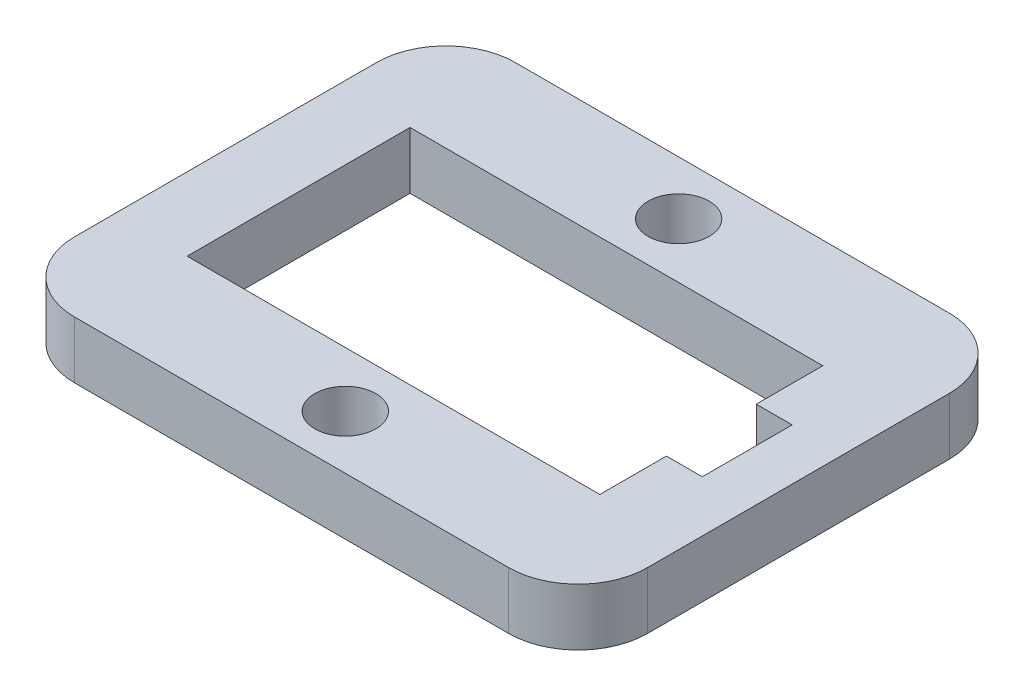
ISO-10303-21;
HEADER;
FILE_DESCRIPTION(('STEP AP214'),'2;1');
FILE_NAME('part.step','',(''),(''),'','','');
FILE_SCHEMA(('AUTOMOTIVE_DESIGN { 1 0 10303 214 1 1 1 1 }'));
ENDSEC;
DATA;
#1=APPLICATION_CONTEXT('core data for automotive mechanical design processes');
#2=APPLICATION_PROTOCOL_DEFINITION('international standard','automotive_design',2000,#1);
#3=PRODUCT_CONTEXT('',#1,'mechanical');
#4=PRODUCT('Part','Part','',(#3));
#5=PRODUCT_RELATED_PRODUCT_CATEGORY('part','',(#4));
#6=PRODUCT_DEFINITION_FORMATION('','',#4);
#7=PRODUCT_DEFINITION_CONTEXT('part definition',#1,'design');
#8=PRODUCT_DEFINITION('design','',#6,#7);
#9=PRODUCT_DEFINITION_SHAPE('','',#8);
#10=(LENGTH_UNIT() NAMED_UNIT(*) SI_UNIT(.MILLI.,.METRE.));
#11=(NAMED_UNIT(*) PLANE_ANGLE_UNIT() SI_UNIT($,.RADIAN.));
#12=(NAMED_UNIT(*) SI_UNIT($,.STERADIAN.) SOLID_ANGLE_UNIT());
#13=UNCERTAINTY_MEASURE_WITH_UNIT(LENGTH_MEASURE(1.E-05),#10,'distance_accuracy_value','');
#14=(GEOMETRIC_REPRESENTATION_CONTEXT(3) GLOBAL_UNCERTAINTY_ASSIGNED_CONTEXT((#13)) GLOBAL_UNIT_ASSIGNED_CONTEXT((#10,
#11,#12)) REPRESENTATION_CONTEXT('',''));
#15=CARTESIAN_POINT('',(0.,0.,0.));
#16=DIRECTION('',(0.,0.,1.));
#17=DIRECTION('',(1.,0.,0.));
#18=AXIS2_PLACEMENT_3D('',#15,#16,#17);
#19=CARTESIAN_POINT('',(-1.42519670598732,3.175,-11.9071943955369));
#20=DIRECTION('',(0.,1.,0.));
#21=DIRECTION('',(0.,0.,1.));
#22=AXIS2_PLACEMENT_3D('',#19,#20,#21);
#23=PLANE('',#22);
#24=CARTESIAN_POINT('',(-13.5078691293302,3.175,-12.7791614699957));
#25=DIRECTION('',(0.,1.,0.));
#26=DIRECTION('',(0.,0.,1.));
#27=AXIS2_PLACEMENT_3D('',#24,#25,#26);
#28=CIRCLE('',#27,1.700000029);
#29=CARTESIAN_POINT('',(-13.5078691293302,3.175,-11.0791614409957));
#30=VERTEX_POINT('',#29);
#31=EDGE_CURVE('E184',#30,#30,#28,.T.);
#32=ORIENTED_EDGE('',*,*,#31,.F.);
#33=EDGE_LOOP('',(#32));
#34=FACE_BOUND('',#33,.T.);
#35=CARTESIAN_POINT('',(-1.42519670598732,3.175,-11.9071943955369));
#36=DIRECTION('',(0.,1.,0.));
#37=DIRECTION('',(0.,0.,1.));
#38=AXIS2_PLACEMENT_3D('',#35,#36,#37);
#39=CIRCLE('',#38,3.85587562995337);
#40=CARTESIAN_POINT('',(2.43067892396605,3.175,-11.9071943955369));
#41=VERTEX_POINT('',#40);
#42=CARTESIAN_POINT('',(-1.42519670598732,3.175,-15.7630700254903));
#43=VERTEX_POINT('',#42);
#44=EDGE_CURVE('E214',#41,#43,#39,.T.);
#45=ORIENTED_EDGE('',*,*,#44,.T.);
#46=DIRECTION('',(-1.,0.,0.));
#47=VECTOR('',#46,1.);
#48=CARTESIAN_POINT('',(-1.42519670598732,3.175,-15.7630700254903));
#49=LINE('',#48,#47);
#50=CARTESIAN_POINT('',(-25.5836145207176,3.175,-15.7630700254903));
#51=VERTEX_POINT('',#50);
#52=EDGE_CURVE('E217',#43,#51,#49,.T.);
#53=ORIENTED_EDGE('',*,*,#52,.T.);
#54=CARTESIAN_POINT('',(-25.5836145207176,3.175,-11.9071943955369));
#55=DIRECTION('',(0.,1.,0.));
#56=DIRECTION('',(0.,0.,1.));
#57=AXIS2_PLACEMENT_3D('',#54,#55,#56);
#58=CIRCLE('',#57,3.85587562995337);
#59=CARTESIAN_POINT('',(-29.439490150671,3.175,-11.9071943955369));
#60=VERTEX_POINT('',#59);
#61=EDGE_CURVE('E220',#51,#60,#58,.T.);
#62=ORIENTED_EDGE('',*,*,#61,.T.);
#63=DIRECTION('',(0.,0.,1.));
#64=VECTOR('',#63,1.);
#65=CARTESIAN_POINT('',(-29.439490150671,3.175,-11.9071943955369));
#66=LINE('',#65,#64);
#67=CARTESIAN_POINT('',(-29.439490150671,3.175,4.88887145954559));
#68=VERTEX_POINT('',#67);
#69=EDGE_CURVE('E222',#60,#68,#66,.T.);
#70=ORIENTED_EDGE('',*,*,#69,.T.);
#71=CARTESIAN_POINT('',(-25.576628785035,3.175,4.88887145954559));
#72=DIRECTION('',(0.,1.,0.));
#73=DIRECTION('',(0.,0.,1.));
#74=AXIS2_PLACEMENT_3D('',#71,#72,#73);
#75=CIRCLE('',#74,3.86286136563595);
#76=CARTESIAN_POINT('',(-25.576628785035,3.175,8.75173282518153));
#77=VERTEX_POINT('',#76);
#78=EDGE_CURVE('E224',#68,#77,#75,.T.);
#79=ORIENTED_EDGE('',*,*,#78,.T.);
#80=DIRECTION('',(1.,0.,0.));
#81=VECTOR('',#80,1.);
#82=CARTESIAN_POINT('',(-25.576628785035,3.175,8.75173282518153));
#83=LINE('',#82,#81);
#84=CARTESIAN_POINT('',(-1.43218244166989,3.175,8.75173282518153));
#85=VERTEX_POINT('',#84);
#86=EDGE_CURVE('E226',#77,#85,#83,.T.);
#87=ORIENTED_EDGE('',*,*,#86,.T.);
#88=CARTESIAN_POINT('',(-1.43218244166989,3.175,4.88887145954558));
#89=DIRECTION('',(0.,1.,0.));
#90=DIRECTION('',(0.,0.,1.));
#91=AXIS2_PLACEMENT_3D('',#88,#89,#90);
#92=CIRCLE('',#91,3.86286136563595);
#93=CARTESIAN_POINT('',(2.43067892396605,3.175,4.88887145954558));
#94=VERTEX_POINT('',#93);
#95=EDGE_CURVE('E228',#85,#94,#92,.T.);
#96=ORIENTED_EDGE('',*,*,#95,.T.);
#97=DIRECTION('',(0.,0.,-1.));
#98=VECTOR('',#97,1.);
#99=CARTESIAN_POINT('',(2.43067892396605,3.175,4.88887145954558));
#100=LINE('',#99,#98);
#101=EDGE_CURVE('E230',#94,#41,#100,.T.);
#102=ORIENTED_EDGE('',*,*,#101,.T.);
#103=EDGE_LOOP('',(#45,#53,#62,#70,#79,#87,#96,#102));
#104=FACE_BOUND('',#103,.T.);
#105=DIRECTION('',(-1.,0.,0.));
#106=VECTOR('',#105,1.);
#107=CARTESIAN_POINT('',(-2.41675038914296,3.175,-9.70933956799569));
#108=LINE('',#107,#106);
#109=CARTESIAN_POINT('',(-2.41675038914296,3.175,-9.70933956799569));
#110=VERTEX_POINT('',#109);
#111=CARTESIAN_POINT('',(-25.3759162308973,3.175,-9.70933956799567));
#112=VERTEX_POINT('',#111);
#113=EDGE_CURVE('E154',#110,#112,#108,.T.);
#114=ORIENTED_EDGE('',*,*,#113,.F.);
#115=DIRECTION('',(0.,0.,-1.));
#116=VECTOR('',#115,1.);
#117=CARTESIAN_POINT('',(-2.41675038914296,3.175,-6.00923992684857));
#118=LINE('',#117,#116);
#119=CARTESIAN_POINT('',(-2.41675038914296,3.175,-6.00923992684857));
#120=VERTEX_POINT('',#119);
#121=EDGE_CURVE('E146',#120,#110,#118,.T.);
#122=ORIENTED_EDGE('',*,*,#121,.F.);
#123=DIRECTION('',(-1.,0.,0.));
#124=VECTOR('',#123,1.);
#125=CARTESIAN_POINT('',(-0.42010239804857,3.175,-6.00923992684857));
#126=LINE('',#125,#124);
#127=CARTESIAN_POINT('',(-0.42010239804857,3.175,-6.00923992684857));
#128=VERTEX_POINT('',#127);
#129=EDGE_CURVE('E181',#128,#120,#126,.T.);
#130=ORIENTED_EDGE('',*,*,#129,.F.);
#131=DIRECTION('',(0.,0.,-1.));
#132=VECTOR('',#131,1.);
#133=CARTESIAN_POINT('',(-0.420102398048568,3.175,-1.00908943940521));
#134=LINE('',#133,#132);
#135=CARTESIAN_POINT('',(-0.420102398048568,3.175,-1.00908943940521));
#136=VERTEX_POINT('',#135);
#137=EDGE_CURVE('E179',#136,#128,#134,.T.);
#138=ORIENTED_EDGE('',*,*,#137,.F.);
#139=DIRECTION('',(1.,0.,0.));
#140=VECTOR('',#139,1.);
#141=CARTESIAN_POINT('',(-2.41675038914296,3.175,-1.00908943940521));
#142=LINE('',#141,#140);
#143=CARTESIAN_POINT('',(-2.41675038914296,3.175,-1.00908943940521));
#144=VERTEX_POINT('',#143);
#145=EDGE_CURVE('E177',#144,#136,#142,.T.);
#146=ORIENTED_EDGE('',*,*,#145,.F.);
#147=DIRECTION('',(0.,0.,-1.));
#148=VECTOR('',#147,1.);
#149=CARTESIAN_POINT('',(-2.41675038914296,3.175,2.6910102017419));
#150=LINE('',#149,#148);
#151=CARTESIAN_POINT('',(-2.41675038914296,3.175,2.6910102017419));
#152=VERTEX_POINT('',#151);
#153=EDGE_CURVE('E175',#152,#144,#150,.T.);
#154=ORIENTED_EDGE('',*,*,#153,.F.);
#155=DIRECTION('',(1.,0.,0.));
#156=VECTOR('',#155,1.);
#157=CARTESIAN_POINT('',(-25.3759162308973,3.175,2.69101020174191));
#158=LINE('',#157,#156);
#159=CARTESIAN_POINT('',(-25.3759162308973,3.175,2.69101020174191));
#160=VERTEX_POINT('',#159);
#161=EDGE_CURVE('E170',#160,#152,#158,.T.);
#162=ORIENTED_EDGE('',*,*,#161,.F.);
#163=DIRECTION('',(0.,0.,1.));
#164=VECTOR('',#163,1.);
#165=CARTESIAN_POINT('',(-25.3759162308973,3.175,-9.70933956799567));
#166=LINE('',#165,#164);
#167=EDGE_CURVE('E168',#112,#160,#166,.T.);
#168=ORIENTED_EDGE('',*,*,#167,.F.);
#169=EDGE_LOOP('',(#114,#122,#130,#138,#146,#154,#162,#168));
#170=FACE_BOUND('',#169,.T.);
#171=CARTESIAN_POINT('',(-13.5078691293302,3.175,5.76083853400432));
#172=DIRECTION('',(0.,1.,0.));
#173=DIRECTION('',(0.,0.,1.));
#174=AXIS2_PLACEMENT_3D('',#171,#172,#173);
#175=CIRCLE('',#174,1.700000029);
#176=CARTESIAN_POINT('',(-13.5078691293302,3.175,7.46083856300432));
#177=VERTEX_POINT('',#176);
#178=EDGE_CURVE('E370',#177,#177,#175,.T.);
#179=ORIENTED_EDGE('',*,*,#178,.F.);
#180=EDGE_LOOP('',(#179));
#181=FACE_BOUND('',#180,.T.);
#182=ADVANCED_FACE('F33',(#34,#104,#170,#181),#23,.T.);
#183=CARTESIAN_POINT('',(-1.42519670598732,0.,-11.9071943955369));
#184=DIRECTION('',(0.,1.,0.));
#185=DIRECTION('',(0.,0.,1.));
#186=AXIS2_PLACEMENT_3D('',#183,#184,#185);
#187=PLANE('',#186);
#188=CARTESIAN_POINT('',(-1.42519670598732,0.,-11.9071943955369));
#189=DIRECTION('',(0.,1.,0.));
#190=DIRECTION('',(0.,0.,1.));
#191=AXIS2_PLACEMENT_3D('',#188,#189,#190);
#192=CIRCLE('',#191,3.85587562995337);
#193=CARTESIAN_POINT('',(2.43067892396605,0.,-11.9071943955369));
#194=VERTEX_POINT('',#193);
#195=CARTESIAN_POINT('',(-1.42519670598732,0.,-15.7630700254903));
#196=VERTEX_POINT('',#195);
#197=EDGE_CURVE('E162',#194,#196,#192,.T.);
#198=ORIENTED_EDGE('',*,*,#197,.F.);
#199=DIRECTION('',(0.,0.,-1.));
#200=VECTOR('',#199,1.);
#201=CARTESIAN_POINT('',(2.43067892396605,0.,4.88887145954558));
#202=LINE('',#201,#200);
#203=CARTESIAN_POINT('',(2.43067892396605,0.,4.88887145954558));
#204=VERTEX_POINT('',#203);
#205=EDGE_CURVE('E218',#204,#194,#202,.T.);
#206=ORIENTED_EDGE('',*,*,#205,.F.);
#207=CARTESIAN_POINT('',(-1.43218244166989,0.,4.88887145954558));
#208=DIRECTION('',(0.,1.,0.));
#209=DIRECTION('',(0.,0.,1.));
#210=AXIS2_PLACEMENT_3D('',#207,#208,#209);
#211=CIRCLE('',#210,3.86286136563595);
#212=CARTESIAN_POINT('',(-1.43218244166989,0.,8.75173282518153));
#213=VERTEX_POINT('',#212);
#214=EDGE_CURVE('E245',#213,#204,#211,.T.);
#215=ORIENTED_EDGE('',*,*,#214,.F.);
#216=DIRECTION('',(1.,0.,0.));
#217=VECTOR('',#216,1.);
#218=CARTESIAN_POINT('',(-25.576628785035,0.,8.75173282518153));
#219=LINE('',#218,#217);
#220=CARTESIAN_POINT('',(-25.576628785035,0.,8.75173282518153));
#221=VERTEX_POINT('',#220);
#222=EDGE_CURVE('E243',#221,#213,#219,.T.);
#223=ORIENTED_EDGE('',*,*,#222,.F.);
#224=CARTESIAN_POINT('',(-25.576628785035,0.,4.88887145954559));
#225=DIRECTION('',(0.,1.,0.));
#226=DIRECTION('',(0.,0.,1.));
#227=AXIS2_PLACEMENT_3D('',#224,#225,#226);
#228=CIRCLE('',#227,3.86286136563595);
#229=CARTESIAN_POINT('',(-29.439490150671,0.,4.88887145954559));
#230=VERTEX_POINT('',#229);
#231=EDGE_CURVE('E241',#230,#221,#228,.T.);
#232=ORIENTED_EDGE('',*,*,#231,.F.);
#233=DIRECTION('',(0.,0.,1.));
#234=VECTOR('',#233,1.);
#235=CARTESIAN_POINT('',(-29.439490150671,0.,-11.9071943955369));
#236=LINE('',#235,#234);
#237=CARTESIAN_POINT('',(-29.439490150671,0.,-11.9071943955369));
#238=VERTEX_POINT('',#237);
#239=EDGE_CURVE('E239',#238,#230,#236,.T.);
#240=ORIENTED_EDGE('',*,*,#239,.F.);
#241=CARTESIAN_POINT('',(-25.5836145207176,0.,-11.9071943955369));
#242=DIRECTION('',(0.,1.,0.));
#243=DIRECTION('',(0.,0.,1.));
#244=AXIS2_PLACEMENT_3D('',#241,#242,#243);
#245=CIRCLE('',#244,3.85587562995337);
#246=CARTESIAN_POINT('',(-25.5836145207176,0.,-15.7630700254903));
#247=VERTEX_POINT('',#246);
#248=EDGE_CURVE('E237',#247,#238,#245,.T.);
#249=ORIENTED_EDGE('',*,*,#248,.F.);
#250=DIRECTION('',(-1.,0.,0.));
#251=VECTOR('',#250,1.);
#252=CARTESIAN_POINT('',(-1.42519670598732,0.,-15.7630700254903));
#253=LINE('',#252,#251);
#254=EDGE_CURVE('E235',#196,#247,#253,.T.);
#255=ORIENTED_EDGE('',*,*,#254,.F.);
#256=EDGE_LOOP('',(#198,#206,#215,#223,#232,#240,#249,#255));
#257=FACE_BOUND('',#256,.T.);
#258=DIRECTION('',(0.,0.,-1.));
#259=VECTOR('',#258,1.);
#260=CARTESIAN_POINT('',(-2.41675038914296,0.,-6.00923992684857));
#261=LINE('',#260,#259);
#262=CARTESIAN_POINT('',(-2.41675038914296,0.,-6.00923992684857));
#263=VERTEX_POINT('',#262);
#264=CARTESIAN_POINT('',(-2.41675038914296,0.,-9.70933956799569));
#265=VERTEX_POINT('',#264);
#266=EDGE_CURVE('E56',#263,#265,#261,.T.);
#267=ORIENTED_EDGE('',*,*,#266,.T.);
#268=DIRECTION('',(-1.,0.,0.));
#269=VECTOR('',#268,1.);
#270=CARTESIAN_POINT('',(-2.41675038914296,0.,-9.70933956799569));
#271=LINE('',#270,#269);
#272=CARTESIAN_POINT('',(-25.3759162308973,0.,-9.70933956799567));
#273=VERTEX_POINT('',#272);
#274=EDGE_CURVE('E161',#265,#273,#271,.T.);
#275=ORIENTED_EDGE('',*,*,#274,.T.);
#276=DIRECTION('',(0.,0.,1.));
#277=VECTOR('',#276,1.);
#278=CARTESIAN_POINT('',(-25.3759162308973,0.,-9.70933956799567));
#279=LINE('',#278,#277);
#280=CARTESIAN_POINT('',(-25.3759162308973,0.,2.69101020174191));
#281=VERTEX_POINT('',#280);
#282=EDGE_CURVE('E186',#273,#281,#279,.T.);
#283=ORIENTED_EDGE('',*,*,#282,.T.);
#284=DIRECTION('',(1.,0.,0.));
#285=VECTOR('',#284,1.);
#286=CARTESIAN_POINT('',(-25.3759162308973,0.,2.69101020174191));
#287=LINE('',#286,#285);
#288=CARTESIAN_POINT('',(-2.41675038914296,0.,2.6910102017419));
#289=VERTEX_POINT('',#288);
#290=EDGE_CURVE('E189',#281,#289,#287,.T.);
#291=ORIENTED_EDGE('',*,*,#290,.T.);
#292=DIRECTION('',(0.,0.,-1.));
#293=VECTOR('',#292,1.);
#294=CARTESIAN_POINT('',(-2.41675038914296,0.,2.6910102017419));
#295=LINE('',#294,#293);
#296=CARTESIAN_POINT('',(-2.41675038914296,0.,-1.00908943940521));
#297=VERTEX_POINT('',#296);
#298=EDGE_CURVE('E192',#289,#297,#295,.T.);
#299=ORIENTED_EDGE('',*,*,#298,.T.);
#300=DIRECTION('',(1.,0.,0.));
#301=VECTOR('',#300,1.);
#302=CARTESIAN_POINT('',(-2.41675038914296,0.,-1.00908943940521));
#303=LINE('',#302,#301);
#304=CARTESIAN_POINT('',(-0.420102398048568,0.,-1.00908943940521));
#305=VERTEX_POINT('',#304);
#306=EDGE_CURVE('E195',#297,#305,#303,.T.);
#307=ORIENTED_EDGE('',*,*,#306,.T.);
#308=DIRECTION('',(0.,0.,-1.));
#309=VECTOR('',#308,1.);
#310=CARTESIAN_POINT('',(-0.420102398048568,0.,-1.00908943940521));
#311=LINE('',#310,#309);
#312=CARTESIAN_POINT('',(-0.42010239804857,0.,-6.00923992684857));
#313=VERTEX_POINT('',#312);
#314=EDGE_CURVE('E198',#305,#313,#311,.T.);
#315=ORIENTED_EDGE('',*,*,#314,.T.);
#316=DIRECTION('',(-1.,0.,0.));
#317=VECTOR('',#316,1.);
#318=CARTESIAN_POINT('',(-0.42010239804857,0.,-6.00923992684857));
#319=LINE('',#318,#317);
#320=EDGE_CURVE('E155',#313,#263,#319,.T.);
#321=ORIENTED_EDGE('',*,*,#320,.T.);
#322=EDGE_LOOP('',(#267,#275,#283,#291,#299,#307,#315,#321));
#323=FACE_BOUND('',#322,.T.);
#324=CARTESIAN_POINT('',(-13.5078691293302,0.,-12.7791614699957));
#325=DIRECTION('',(0.,1.,0.));
#326=DIRECTION('',(0.,0.,1.));
#327=AXIS2_PLACEMENT_3D('',#324,#325,#326);
#328=CIRCLE('',#327,1.700000029);
#329=CARTESIAN_POINT('',(-13.5078691293302,0.,-11.0791614409957));
#330=VERTEX_POINT('',#329);
#331=EDGE_CURVE('E376',#330,#330,#328,.T.);
#332=ORIENTED_EDGE('',*,*,#331,.T.);
#333=EDGE_LOOP('',(#332));
#334=FACE_BOUND('',#333,.T.);
#335=CARTESIAN_POINT('',(-13.5078691293302,0.,5.76083853400432));
#336=DIRECTION('',(0.,1.,0.));
#337=DIRECTION('',(0.,0.,1.));
#338=AXIS2_PLACEMENT_3D('',#335,#336,#337);
#339=CIRCLE('',#338,1.700000029);
#340=CARTESIAN_POINT('',(-13.5078691293302,0.,7.46083856300432));
#341=VERTEX_POINT('',#340);
#342=EDGE_CURVE('E373',#341,#341,#339,.T.);
#343=ORIENTED_EDGE('',*,*,#342,.T.);
#344=EDGE_LOOP('',(#343));
#345=FACE_BOUND('',#344,.T.);
#346=ADVANCED_FACE('F275',(#257,#323,#334,#345),#187,.F.);
#347=CARTESIAN_POINT('',(-1.42519670598732,3.175,-11.9071943955369));
#348=DIRECTION('',(0.,-1.,0.));
#349=DIRECTION('',(0.,0.,-1.));
#350=AXIS2_PLACEMENT_3D('',#347,#348,#349);
#351=CYLINDRICAL_SURFACE('',#350,3.85587562995337);
#352=ORIENTED_EDGE('',*,*,#197,.T.);
#353=DIRECTION('',(0.,-1.,0.));
#354=VECTOR('',#353,1.);
#355=CARTESIAN_POINT('',(-1.42519670598732,3.175,-15.7630700254903));
#356=LINE('',#355,#354);
#357=EDGE_CURVE('E11',#43,#196,#356,.T.);
#358=ORIENTED_EDGE('',*,*,#357,.F.);
#359=ORIENTED_EDGE('',*,*,#44,.F.);
#360=DIRECTION('',(0.,-1.,0.));
#361=VECTOR('',#360,1.);
#362=CARTESIAN_POINT('',(2.43067892396605,3.175,-11.9071943955369));
#363=LINE('',#362,#361);
#364=EDGE_CURVE('E232',#41,#194,#363,.T.);
#365=ORIENTED_EDGE('',*,*,#364,.T.);
#366=EDGE_LOOP('',(#352,#358,#359,#365));
#367=FACE_BOUND('',#366,.T.);
#368=ADVANCED_FACE('F35',(#367),#351,.T.);
#369=CARTESIAN_POINT('',(-1.42519670598732,3.175,-15.7630700254903));
#370=DIRECTION('',(0.,0.,1.));
#371=DIRECTION('',(1.,0.,0.));
#372=AXIS2_PLACEMENT_3D('',#369,#370,#371);
#373=PLANE('',#372);
#374=ORIENTED_EDGE('',*,*,#254,.T.);
#375=DIRECTION('',(0.,-1.,0.));
#376=VECTOR('',#375,1.);
#377=CARTESIAN_POINT('',(-25.5836145207176,3.175,-15.7630700254903));
#378=LINE('',#377,#376);
#379=EDGE_CURVE('E41',#51,#247,#378,.T.);
#380=ORIENTED_EDGE('',*,*,#379,.F.);
#381=ORIENTED_EDGE('',*,*,#52,.F.);
#382=ORIENTED_EDGE('',*,*,#357,.T.);
#383=EDGE_LOOP('',(#374,#380,#381,#382));
#384=FACE_BOUND('',#383,.T.);
#385=ADVANCED_FACE('F292',(#384),#373,.F.);
#386=CARTESIAN_POINT('',(-25.5836145207176,3.175,-11.9071943955369));
#387=DIRECTION('',(0.,-1.,0.));
#388=DIRECTION('',(0.,0.,-1.));
#389=AXIS2_PLACEMENT_3D('',#386,#387,#388);
#390=CYLINDRICAL_SURFACE('',#389,3.85587562995337);
#391=ORIENTED_EDGE('',*,*,#248,.T.);
#392=DIRECTION('',(0.,-1.,0.));
#393=VECTOR('',#392,1.);
#394=CARTESIAN_POINT('',(-29.439490150671,3.175,-11.9071943955369));
#395=LINE('',#394,#393);
#396=EDGE_CURVE('E262',#60,#238,#395,.T.);
#397=ORIENTED_EDGE('',*,*,#396,.F.);
#398=ORIENTED_EDGE('',*,*,#61,.F.);
#399=ORIENTED_EDGE('',*,*,#379,.T.);
#400=EDGE_LOOP('',(#391,#397,#398,#399));
#401=FACE_BOUND('',#400,.T.);
#402=ADVANCED_FACE('F269',(#401),#390,.T.);
#403=CARTESIAN_POINT('',(-29.439490150671,3.175,-11.9071943955369));
#404=DIRECTION('',(1.,0.,0.));
#405=DIRECTION('',(0.,0.,-1.));
#406=AXIS2_PLACEMENT_3D('',#403,#404,#405);
#407=PLANE('',#406);
#408=ORIENTED_EDGE('',*,*,#239,.T.);
#409=DIRECTION('',(0.,-1.,0.));
#410=VECTOR('',#409,1.);
#411=CARTESIAN_POINT('',(-29.439490150671,3.175,4.88887145954559));
#412=LINE('',#411,#410);
#413=EDGE_CURVE('E259',#68,#230,#412,.T.);
#414=ORIENTED_EDGE('',*,*,#413,.F.);
#415=ORIENTED_EDGE('',*,*,#69,.F.);
#416=ORIENTED_EDGE('',*,*,#396,.T.);
#417=EDGE_LOOP('',(#408,#414,#415,#416));
#418=FACE_BOUND('',#417,.T.);
#419=ADVANCED_FACE('F281',(#418),#407,.F.);
#420=CARTESIAN_POINT('',(-25.576628785035,3.175,4.88887145954559));
#421=DIRECTION('',(0.,-1.,0.));
#422=DIRECTION('',(0.,0.,-1.));
#423=AXIS2_PLACEMENT_3D('',#420,#421,#422);
#424=CYLINDRICAL_SURFACE('',#423,3.86286136563595);
#425=ORIENTED_EDGE('',*,*,#231,.T.);
#426=DIRECTION('',(0.,-1.,0.));
#427=VECTOR('',#426,1.);
#428=CARTESIAN_POINT('',(-25.576628785035,3.175,8.75173282518153));
#429=LINE('',#428,#427);
#430=EDGE_CURVE('E256',#77,#221,#429,.T.);
#431=ORIENTED_EDGE('',*,*,#430,.F.);
#432=ORIENTED_EDGE('',*,*,#78,.F.);
#433=ORIENTED_EDGE('',*,*,#413,.T.);
#434=EDGE_LOOP('',(#425,#431,#432,#433));
#435=FACE_BOUND('',#434,.T.);
#436=ADVANCED_FACE('F285',(#435),#424,.T.);
#437=CARTESIAN_POINT('',(-25.576628785035,3.175,8.75173282518153));
#438=DIRECTION('',(0.,0.,-1.));
#439=DIRECTION('',(-1.,0.,0.));
#440=AXIS2_PLACEMENT_3D('',#437,#438,#439);
#441=PLANE('',#440);
#442=ORIENTED_EDGE('',*,*,#222,.T.);
#443=DIRECTION('',(0.,-1.,0.));
#444=VECTOR('',#443,1.);
#445=CARTESIAN_POINT('',(-1.43218244166989,3.175,8.75173282518153));
#446=LINE('',#445,#444);
#447=EDGE_CURVE('E253',#85,#213,#446,.T.);
#448=ORIENTED_EDGE('',*,*,#447,.F.);
#449=ORIENTED_EDGE('',*,*,#86,.F.);
#450=ORIENTED_EDGE('',*,*,#430,.T.);
#451=EDGE_LOOP('',(#442,#448,#449,#450));
#452=FACE_BOUND('',#451,.T.);
#453=ADVANCED_FACE('F305',(#452),#441,.F.);
#454=CARTESIAN_POINT('',(-1.43218244166989,3.175,4.88887145954558));
#455=DIRECTION('',(0.,-1.,0.));
#456=DIRECTION('',(0.,0.,-1.));
#457=AXIS2_PLACEMENT_3D('',#454,#455,#456);
#458=CYLINDRICAL_SURFACE('',#457,3.86286136563595);
#459=ORIENTED_EDGE('',*,*,#214,.T.);
#460=DIRECTION('',(0.,-1.,0.));
#461=VECTOR('',#460,1.);
#462=CARTESIAN_POINT('',(2.43067892396605,3.175,4.88887145954558));
#463=LINE('',#462,#461);
#464=EDGE_CURVE('E250',#94,#204,#463,.T.);
#465=ORIENTED_EDGE('',*,*,#464,.F.);
#466=ORIENTED_EDGE('',*,*,#95,.F.);
#467=ORIENTED_EDGE('',*,*,#447,.T.);
#468=EDGE_LOOP('',(#459,#465,#466,#467));
#469=FACE_BOUND('',#468,.T.);
#470=ADVANCED_FACE('F303',(#469),#458,.T.);
#471=CARTESIAN_POINT('',(2.43067892396605,3.175,4.88887145954558));
#472=DIRECTION('',(-1.,0.,0.));
#473=DIRECTION('',(0.,0.,1.));
#474=AXIS2_PLACEMENT_3D('',#471,#472,#473);
#475=PLANE('',#474);
#476=ORIENTED_EDGE('',*,*,#205,.T.);
#477=ORIENTED_EDGE('',*,*,#364,.F.);
#478=ORIENTED_EDGE('',*,*,#101,.F.);
#479=ORIENTED_EDGE('',*,*,#464,.T.);
#480=EDGE_LOOP('',(#476,#477,#478,#479));
#481=FACE_BOUND('',#480,.T.);
#482=ADVANCED_FACE('F298',(#481),#475,.F.);
#483=CARTESIAN_POINT('',(-2.41675038914296,3.175,-6.00923992684857));
#484=DIRECTION('',(-1.,0.,0.));
#485=DIRECTION('',(0.,0.,1.));
#486=AXIS2_PLACEMENT_3D('',#483,#484,#485);
#487=PLANE('',#486);
#488=ORIENTED_EDGE('',*,*,#266,.F.);
#489=DIRECTION('',(0.,-1.,0.));
#490=VECTOR('',#489,1.);
#491=CARTESIAN_POINT('',(-2.41675038914296,3.175,-6.00923992684857));
#492=LINE('',#491,#490);
#493=EDGE_CURVE('E150',#120,#263,#492,.T.);
#494=ORIENTED_EDGE('',*,*,#493,.F.);
#495=ORIENTED_EDGE('',*,*,#121,.T.);
#496=DIRECTION('',(0.,-1.,0.));
#497=VECTOR('',#496,1.);
#498=CARTESIAN_POINT('',(-2.41675038914296,3.175,-9.70933956799569));
#499=LINE('',#498,#497);
#500=EDGE_CURVE('E149',#110,#265,#499,.T.);
#501=ORIENTED_EDGE('',*,*,#500,.T.);
#502=EDGE_LOOP('',(#488,#494,#495,#501));
#503=FACE_BOUND('',#502,.T.);
#504=ADVANCED_FACE('F148',(#503),#487,.T.);
#505=CARTESIAN_POINT('',(-2.41675038914296,3.175,-9.70933956799569));
#506=DIRECTION('',(0.,0.,1.));
#507=DIRECTION('',(1.,0.,0.));
#508=AXIS2_PLACEMENT_3D('',#505,#506,#507);
#509=PLANE('',#508);
#510=ORIENTED_EDGE('',*,*,#274,.F.);
#511=ORIENTED_EDGE('',*,*,#500,.F.);
#512=ORIENTED_EDGE('',*,*,#113,.T.);
#513=DIRECTION('',(0.,-1.,0.));
#514=VECTOR('',#513,1.);
#515=CARTESIAN_POINT('',(-25.3759162308973,3.175,-9.70933956799567));
#516=LINE('',#515,#514);
#517=EDGE_CURVE('E163',#112,#273,#516,.T.);
#518=ORIENTED_EDGE('',*,*,#517,.T.);
#519=EDGE_LOOP('',(#510,#511,#512,#518));
#520=FACE_BOUND('',#519,.T.);
#521=ADVANCED_FACE('F158',(#520),#509,.T.);
#522=CARTESIAN_POINT('',(-25.3759162308973,3.175,-9.70933956799567));
#523=DIRECTION('',(1.,0.,0.));
#524=DIRECTION('',(0.,0.,-1.));
#525=AXIS2_PLACEMENT_3D('',#522,#523,#524);
#526=PLANE('',#525);
#527=ORIENTED_EDGE('',*,*,#282,.F.);
#528=ORIENTED_EDGE('',*,*,#517,.F.);
#529=ORIENTED_EDGE('',*,*,#167,.T.);
#530=DIRECTION('',(0.,-1.,0.));
#531=VECTOR('',#530,1.);
#532=CARTESIAN_POINT('',(-25.3759162308973,3.175,2.69101020174191));
#533=LINE('',#532,#531);
#534=EDGE_CURVE('E211',#160,#281,#533,.T.);
#535=ORIENTED_EDGE('',*,*,#534,.T.);
#536=EDGE_LOOP('',(#527,#528,#529,#535));
#537=FACE_BOUND('',#536,.T.);
#538=ADVANCED_FACE('F332',(#537),#526,.T.);
#539=CARTESIAN_POINT('',(-25.3759162308973,3.175,2.69101020174191));
#540=DIRECTION('',(0.,0.,-1.));
#541=DIRECTION('',(-1.,0.,0.));
#542=AXIS2_PLACEMENT_3D('',#539,#540,#541);
#543=PLANE('',#542);
#544=ORIENTED_EDGE('',*,*,#290,.F.);
#545=ORIENTED_EDGE('',*,*,#534,.F.);
#546=ORIENTED_EDGE('',*,*,#161,.T.);
#547=DIRECTION('',(0.,-1.,0.));
#548=VECTOR('',#547,1.);
#549=CARTESIAN_POINT('',(-2.41675038914296,3.175,2.6910102017419));
#550=LINE('',#549,#548);
#551=EDGE_CURVE('E209',#152,#289,#550,.T.);
#552=ORIENTED_EDGE('',*,*,#551,.T.);
#553=EDGE_LOOP('',(#544,#545,#546,#552));
#554=FACE_BOUND('',#553,.T.);
#555=ADVANCED_FACE('F336',(#554),#543,.T.);
#556=CARTESIAN_POINT('',(-2.41675038914296,3.175,2.6910102017419));
#557=DIRECTION('',(-1.,0.,0.));
#558=DIRECTION('',(0.,0.,1.));
#559=AXIS2_PLACEMENT_3D('',#556,#557,#558);
#560=PLANE('',#559);
#561=ORIENTED_EDGE('',*,*,#298,.F.);
#562=ORIENTED_EDGE('',*,*,#551,.F.);
#563=ORIENTED_EDGE('',*,*,#153,.T.);
#564=DIRECTION('',(0.,-1.,0.));
#565=VECTOR('',#564,1.);
#566=CARTESIAN_POINT('',(-2.41675038914296,3.175,-1.00908943940521));
#567=LINE('',#566,#565);
#568=EDGE_CURVE('E207',#144,#297,#567,.T.);
#569=ORIENTED_EDGE('',*,*,#568,.T.);
#570=EDGE_LOOP('',(#561,#562,#563,#569));
#571=FACE_BOUND('',#570,.T.);
#572=ADVANCED_FACE('F342',(#571),#560,.T.);
#573=CARTESIAN_POINT('',(-2.41675038914296,3.175,-1.00908943940521));
#574=DIRECTION('',(0.,0.,-1.));
#575=DIRECTION('',(-1.,0.,0.));
#576=AXIS2_PLACEMENT_3D('',#573,#574,#575);
#577=PLANE('',#576);
#578=ORIENTED_EDGE('',*,*,#306,.F.);
#579=ORIENTED_EDGE('',*,*,#568,.F.);
#580=ORIENTED_EDGE('',*,*,#145,.T.);
#581=DIRECTION('',(0.,-1.,0.));
#582=VECTOR('',#581,1.);
#583=CARTESIAN_POINT('',(-0.420102398048568,3.175,-1.00908943940521));
#584=LINE('',#583,#582);
#585=EDGE_CURVE('E205',#136,#305,#584,.T.);
#586=ORIENTED_EDGE('',*,*,#585,.T.);
#587=EDGE_LOOP('',(#578,#579,#580,#586));
#588=FACE_BOUND('',#587,.T.);
#589=ADVANCED_FACE('F346',(#588),#577,.T.);
#590=CARTESIAN_POINT('',(-0.420102398048568,3.175,-1.00908943940521));
#591=DIRECTION('',(-1.,0.,0.));
#592=DIRECTION('',(0.,0.,1.));
#593=AXIS2_PLACEMENT_3D('',#590,#591,#592);
#594=PLANE('',#593);
#595=ORIENTED_EDGE('',*,*,#314,.F.);
#596=ORIENTED_EDGE('',*,*,#585,.F.);
#597=ORIENTED_EDGE('',*,*,#137,.T.);
#598=DIRECTION('',(0.,-1.,0.));
#599=VECTOR('',#598,1.);
#600=CARTESIAN_POINT('',(-0.42010239804857,3.175,-6.00923992684857));
#601=LINE('',#600,#599);
#602=EDGE_CURVE('E48',#128,#313,#601,.T.);
#603=ORIENTED_EDGE('',*,*,#602,.T.);
#604=EDGE_LOOP('',(#595,#596,#597,#603));
#605=FACE_BOUND('',#604,.T.);
#606=ADVANCED_FACE('F350',(#605),#594,.T.);
#607=CARTESIAN_POINT('',(-0.42010239804857,3.175,-6.00923992684857));
#608=DIRECTION('',(0.,0.,1.));
#609=DIRECTION('',(1.,0.,0.));
#610=AXIS2_PLACEMENT_3D('',#607,#608,#609);
#611=PLANE('',#610);
#612=ORIENTED_EDGE('',*,*,#320,.F.);
#613=ORIENTED_EDGE('',*,*,#602,.F.);
#614=ORIENTED_EDGE('',*,*,#129,.T.);
#615=ORIENTED_EDGE('',*,*,#493,.T.);
#616=EDGE_LOOP('',(#612,#613,#614,#615));
#617=FACE_BOUND('',#616,.T.);
#618=ADVANCED_FACE('F354',(#617),#611,.T.);
#619=CARTESIAN_POINT('',(-13.5078691293302,3.175,-12.7791614699957));
#620=DIRECTION('',(0.,-1.,0.));
#621=DIRECTION('',(0.,0.,-1.));
#622=AXIS2_PLACEMENT_3D('',#619,#620,#621);
#623=CYLINDRICAL_SURFACE('',#622,1.700000029);
#624=ORIENTED_EDGE('',*,*,#31,.T.);
#625=EDGE_LOOP('',(#624));
#626=FACE_BOUND('',#625,.T.);
#627=ORIENTED_EDGE('',*,*,#331,.F.);
#628=EDGE_LOOP('',(#627));
#629=FACE_BOUND('',#628,.T.);
#630=ADVANCED_FACE('F358',(#626,#629),#623,.F.);
#631=CARTESIAN_POINT('',(-13.5078691293302,3.175,5.76083853400432));
#632=DIRECTION('',(0.,-1.,0.));
#633=DIRECTION('',(0.,0.,-1.));
#634=AXIS2_PLACEMENT_3D('',#631,#632,#633);
#635=CYLINDRICAL_SURFACE('',#634,1.700000029);
#636=ORIENTED_EDGE('',*,*,#178,.T.);
#637=EDGE_LOOP('',(#636));
#638=FACE_BOUND('',#637,.T.);
#639=ORIENTED_EDGE('',*,*,#342,.F.);
#640=EDGE_LOOP('',(#639));
#641=FACE_BOUND('',#640,.T.);
#642=ADVANCED_FACE('F361',(#638,#641),#635,.F.);
#643=CLOSED_SHELL('',(#182,#346,#368,#385,#402,#419,#436,#453,#470,#482,#504,#521,#538,#555,
#572,#589,#606,#618,#630,#642));
#644=MANIFOLD_SOLID_BREP('B2',#643);
#645=ADVANCED_BREP_SHAPE_REPRESENTATION('',(#18,#644),#14);
#646=SHAPE_DEFINITION_REPRESENTATION(#9,#645);
ENDSEC;
END-ISO-10303-21;
